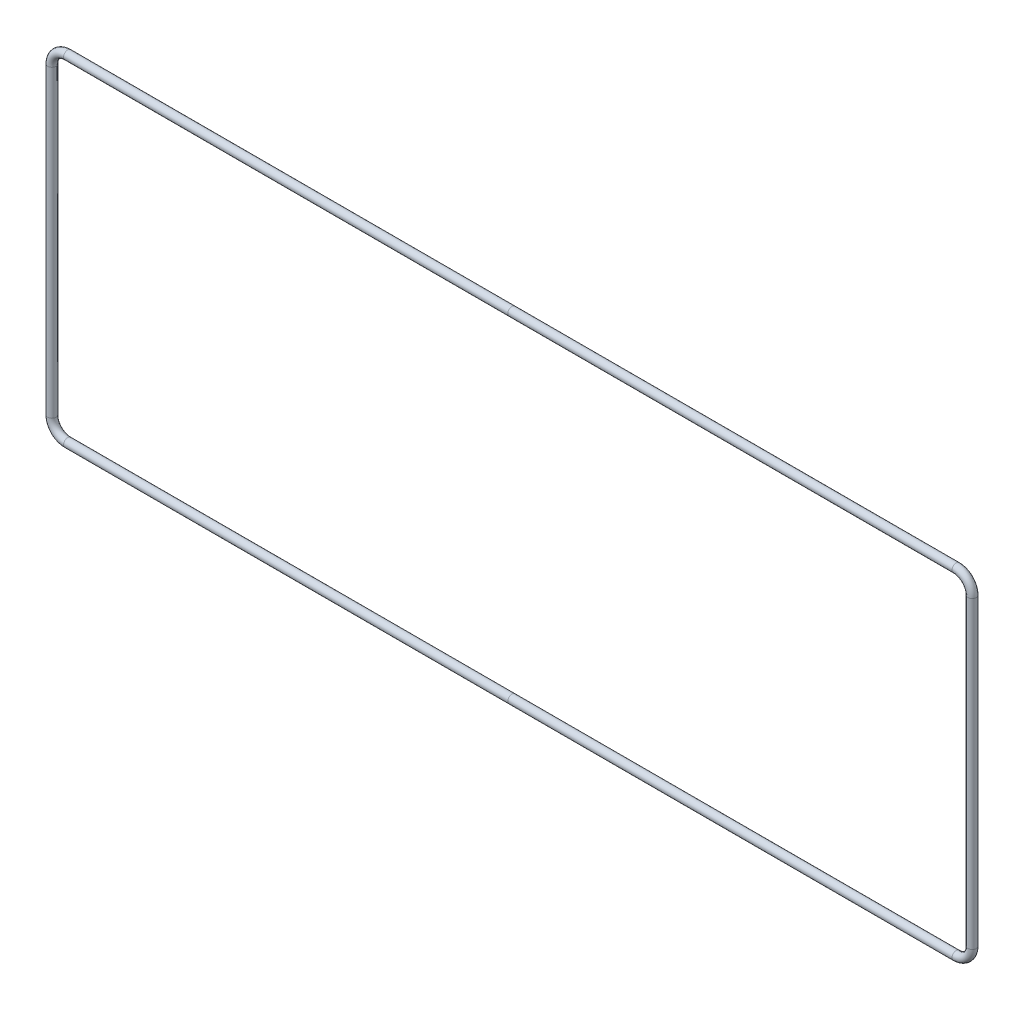
ISO-10303-21;
HEADER;
FILE_DESCRIPTION(('STEP AP214'),'2;1');
FILE_NAME('part.step','',(''),(''),'','','');
FILE_SCHEMA(('AUTOMOTIVE_DESIGN { 1 0 10303 214 1 1 1 1 }'));
ENDSEC;
DATA;
#1=APPLICATION_CONTEXT('core data for automotive mechanical design processes');
#2=APPLICATION_PROTOCOL_DEFINITION('international standard','automotive_design',2000,#1);
#3=PRODUCT_CONTEXT('',#1,'mechanical');
#4=PRODUCT('Part','Part','',(#3));
#5=PRODUCT_RELATED_PRODUCT_CATEGORY('part','',(#4));
#6=PRODUCT_DEFINITION_FORMATION('','',#4);
#7=PRODUCT_DEFINITION_CONTEXT('part definition',#1,'design');
#8=PRODUCT_DEFINITION('design','',#6,#7);
#9=PRODUCT_DEFINITION_SHAPE('','',#8);
#10=(LENGTH_UNIT() NAMED_UNIT(*) SI_UNIT(.MILLI.,.METRE.));
#11=(NAMED_UNIT(*) PLANE_ANGLE_UNIT() SI_UNIT($,.RADIAN.));
#12=(NAMED_UNIT(*) SI_UNIT($,.STERADIAN.) SOLID_ANGLE_UNIT());
#13=UNCERTAINTY_MEASURE_WITH_UNIT(LENGTH_MEASURE(1.E-05),#10,'distance_accuracy_value','');
#14=(GEOMETRIC_REPRESENTATION_CONTEXT(3) GLOBAL_UNCERTAINTY_ASSIGNED_CONTEXT((#13)) GLOBAL_UNIT_ASSIGNED_CONTEXT((#10,
#11,#12)) REPRESENTATION_CONTEXT('',''));
#15=CARTESIAN_POINT('',(0.,0.,0.));
#16=DIRECTION('',(0.,0.,1.));
#17=DIRECTION('',(1.,0.,0.));
#18=AXIS2_PLACEMENT_3D('',#15,#16,#17);
#19=CARTESIAN_POINT('',(-133.,64.9798743683679,0.));
#20=DIRECTION('',(1.,0.,0.));
#21=DIRECTION('',(0.,1.,0.));
#22=AXIS2_PLACEMENT_3D('',#19,#20,#21);
#23=CYLINDRICAL_SURFACE('',#22,1.25);
#24=CARTESIAN_POINT('',(-5.85005856946777E-13,64.9798743683688,0.));
#25=DIRECTION('',(1.,0.,0.));
#26=DIRECTION('',(0.,0.,-1.));
#27=AXIS2_PLACEMENT_3D('',#24,#25,#26);
#28=CIRCLE('',#27,1.25);
#29=CARTESIAN_POINT('',(-5.85005856946777E-13,64.9798743683688,-1.25));
#30=VERTEX_POINT('',#29);
#31=EDGE_CURVE('E66',#30,#30,#28,.T.);
#32=ORIENTED_EDGE('',*,*,#31,.F.);
#33=EDGE_LOOP('',(#32));
#34=FACE_BOUND('',#33,.T.);
#35=CARTESIAN_POINT('',(-133.,64.9798743683679,0.));
#36=DIRECTION('',(1.,0.,0.));
#37=DIRECTION('',(0.,0.,-1.));
#38=AXIS2_PLACEMENT_3D('',#35,#36,#37);
#39=CIRCLE('',#38,1.25);
#40=CARTESIAN_POINT('',(-133.,66.2298743683679,0.));
#41=VERTEX_POINT('',#40);
#42=EDGE_CURVE('E10',#41,#41,#39,.T.);
#43=ORIENTED_EDGE('',*,*,#42,.T.);
#44=EDGE_LOOP('',(#43));
#45=FACE_BOUND('',#44,.T.);
#46=ADVANCED_FACE('F32',(#34,#45),#23,.T.);
#47=CARTESIAN_POINT('',(-133.,60.2298743683679,0.));
#48=DIRECTION('',(0.,0.,-1.));
#49=DIRECTION('',(-1.,0.,0.));
#50=AXIS2_PLACEMENT_3D('',#47,#48,#49);
#51=TOROIDAL_SURFACE('',#50,4.75,1.25);
#52=CARTESIAN_POINT('',(-137.75,60.2298743683679,0.));
#53=DIRECTION('',(0.,1.,0.));
#54=DIRECTION('',(0.,0.,-1.));
#55=AXIS2_PLACEMENT_3D('',#52,#53,#54);
#56=CIRCLE('',#55,1.25);
#57=CARTESIAN_POINT('',(-139.,60.2298743683679,0.));
#58=VERTEX_POINT('',#57);
#59=EDGE_CURVE('E38',#58,#58,#56,.T.);
#60=CARTESIAN_POINT('',(-133.,60.2298743683679,0.));
#61=DIRECTION('',(0.,0.,-1.));
#62=DIRECTION('',(-1.,0.,0.));
#63=AXIS2_PLACEMENT_3D('',#60,#61,#62);
#64=CIRCLE('',#63,6.00000000000001);
#65=EDGE_CURVE('',#58,#41,#64,.T.);
#66=ORIENTED_EDGE('',*,*,#59,.T.);
#67=ORIENTED_EDGE('',*,*,#42,.F.);
#68=ORIENTED_EDGE('',*,*,#65,.T.);
#69=ORIENTED_EDGE('',*,*,#65,.F.);
#70=EDGE_LOOP('',(#66,#68,#67,#69));
#71=FACE_BOUND('',#70,.T.);
#72=ADVANCED_FACE('F73',(#71),#51,.T.);
#73=CARTESIAN_POINT('',(-137.75,-30.7701256316322,0.));
#74=DIRECTION('',(0.,1.,0.));
#75=DIRECTION('',(-1.,0.,0.));
#76=AXIS2_PLACEMENT_3D('',#73,#74,#75);
#77=CYLINDRICAL_SURFACE('',#76,1.25);
#78=ORIENTED_EDGE('',*,*,#59,.F.);
#79=EDGE_LOOP('',(#78));
#80=FACE_BOUND('',#79,.T.);
#81=CARTESIAN_POINT('',(-137.75,-30.7701256316322,0.));
#82=DIRECTION('',(0.,1.,0.));
#83=DIRECTION('',(0.,0.,-1.));
#84=AXIS2_PLACEMENT_3D('',#81,#82,#83);
#85=CIRCLE('',#84,1.25);
#86=CARTESIAN_POINT('',(-139.,-30.7701256316322,0.));
#87=VERTEX_POINT('',#86);
#88=EDGE_CURVE('E42',#87,#87,#85,.T.);
#89=ORIENTED_EDGE('',*,*,#88,.T.);
#90=EDGE_LOOP('',(#89));
#91=FACE_BOUND('',#90,.T.);
#92=ADVANCED_FACE('F77',(#80,#91),#77,.T.);
#93=CARTESIAN_POINT('',(-133.,-30.7701256316322,0.));
#94=DIRECTION('',(0.,0.,-1.));
#95=DIRECTION('',(-1.,0.,0.));
#96=AXIS2_PLACEMENT_3D('',#93,#94,#95);
#97=TOROIDAL_SURFACE('',#96,4.75,1.25);
#98=CARTESIAN_POINT('',(-133.,-35.5201256316322,0.));
#99=DIRECTION('',(-1.,0.,0.));
#100=DIRECTION('',(0.,0.,-1.));
#101=AXIS2_PLACEMENT_3D('',#98,#99,#100);
#102=CIRCLE('',#101,1.25);
#103=CARTESIAN_POINT('',(-133.,-36.7701256316322,0.));
#104=VERTEX_POINT('',#103);
#105=EDGE_CURVE('E46',#104,#104,#102,.T.);
#106=CARTESIAN_POINT('',(-133.,-30.7701256316322,0.));
#107=DIRECTION('',(0.,0.,-1.));
#108=DIRECTION('',(-1.,0.,0.));
#109=AXIS2_PLACEMENT_3D('',#106,#107,#108);
#110=CIRCLE('',#109,6.00000000000001);
#111=EDGE_CURVE('',#104,#87,#110,.T.);
#112=ORIENTED_EDGE('',*,*,#105,.T.);
#113=ORIENTED_EDGE('',*,*,#88,.F.);
#114=ORIENTED_EDGE('',*,*,#111,.T.);
#115=ORIENTED_EDGE('',*,*,#111,.F.);
#116=EDGE_LOOP('',(#112,#114,#113,#115));
#117=FACE_BOUND('',#116,.T.);
#118=ADVANCED_FACE('F82',(#117),#97,.T.);
#119=CARTESIAN_POINT('',(2.22044604925031E-13,-35.5201256316313,0.));
#120=DIRECTION('',(-1.,0.,0.));
#121=DIRECTION('',(0.,-1.,0.));
#122=AXIS2_PLACEMENT_3D('',#119,#120,#121);
#123=CYLINDRICAL_SURFACE('',#122,1.25);
#124=ORIENTED_EDGE('',*,*,#105,.F.);
#125=EDGE_LOOP('',(#124));
#126=FACE_BOUND('',#125,.T.);
#127=CARTESIAN_POINT('',(2.22044604925031E-13,-35.5201256316313,0.));
#128=DIRECTION('',(-1.,0.,0.));
#129=DIRECTION('',(0.,0.,-1.));
#130=AXIS2_PLACEMENT_3D('',#127,#128,#129);
#131=CIRCLE('',#130,1.25);
#132=CARTESIAN_POINT('',(2.22044604925031E-13,-35.5201256316313,-1.25));
#133=VERTEX_POINT('',#132);
#134=EDGE_CURVE('E51',#133,#133,#131,.T.);
#135=ORIENTED_EDGE('',*,*,#134,.T.);
#136=EDGE_LOOP('',(#135));
#137=FACE_BOUND('',#136,.T.);
#138=ADVANCED_FACE('F88',(#126,#137),#123,.T.);
#139=CARTESIAN_POINT('',(133.,-35.5201256316313,0.));
#140=DIRECTION('',(-1.,0.,0.));
#141=DIRECTION('',(0.,0.,1.));
#142=AXIS2_PLACEMENT_3D('',#139,#140,#141);
#143=CYLINDRICAL_SURFACE('',#142,1.25);
#144=ORIENTED_EDGE('',*,*,#134,.F.);
#145=EDGE_LOOP('',(#144));
#146=FACE_BOUND('',#145,.T.);
#147=CARTESIAN_POINT('',(133.,-35.5201256316313,0.));
#148=DIRECTION('',(-1.,0.,0.));
#149=DIRECTION('',(0.,0.,-1.));
#150=AXIS2_PLACEMENT_3D('',#147,#148,#149);
#151=CIRCLE('',#150,1.25);
#152=CARTESIAN_POINT('',(133.,-36.7701256316313,0.));
#153=VERTEX_POINT('',#152);
#154=EDGE_CURVE('E54',#153,#153,#151,.T.);
#155=ORIENTED_EDGE('',*,*,#154,.T.);
#156=EDGE_LOOP('',(#155));
#157=FACE_BOUND('',#156,.T.);
#158=ADVANCED_FACE('F92',(#146,#157),#143,.T.);
#159=CARTESIAN_POINT('',(133.,-30.7701256316313,0.));
#160=DIRECTION('',(0.,0.,-1.));
#161=DIRECTION('',(-1.,0.,0.));
#162=AXIS2_PLACEMENT_3D('',#159,#160,#161);
#163=TOROIDAL_SURFACE('',#162,4.75,1.25);
#164=CARTESIAN_POINT('',(137.75,-30.7701256316313,0.));
#165=DIRECTION('',(0.,-1.,0.));
#166=DIRECTION('',(0.,0.,-1.));
#167=AXIS2_PLACEMENT_3D('',#164,#165,#166);
#168=CIRCLE('',#167,1.25);
#169=CARTESIAN_POINT('',(139.,-30.7701256316313,0.));
#170=VERTEX_POINT('',#169);
#171=EDGE_CURVE('E57',#170,#170,#168,.T.);
#172=CARTESIAN_POINT('',(133.,-30.7701256316313,0.));
#173=DIRECTION('',(0.,0.,-1.));
#174=DIRECTION('',(-1.,0.,0.));
#175=AXIS2_PLACEMENT_3D('',#172,#173,#174);
#176=CIRCLE('',#175,6.00000000000001);
#177=EDGE_CURVE('',#170,#153,#176,.T.);
#178=ORIENTED_EDGE('',*,*,#171,.T.);
#179=ORIENTED_EDGE('',*,*,#154,.F.);
#180=ORIENTED_EDGE('',*,*,#177,.T.);
#181=ORIENTED_EDGE('',*,*,#177,.F.);
#182=EDGE_LOOP('',(#178,#180,#179,#181));
#183=FACE_BOUND('',#182,.T.);
#184=ADVANCED_FACE('F96',(#183),#163,.T.);
#185=CARTESIAN_POINT('',(137.75,60.2298743683688,0.));
#186=DIRECTION('',(0.,-1.,0.));
#187=DIRECTION('',(0.,0.,-1.));
#188=AXIS2_PLACEMENT_3D('',#185,#186,#187);
#189=CYLINDRICAL_SURFACE('',#188,1.25);
#190=ORIENTED_EDGE('',*,*,#171,.F.);
#191=EDGE_LOOP('',(#190));
#192=FACE_BOUND('',#191,.T.);
#193=CARTESIAN_POINT('',(137.75,60.2298743683688,0.));
#194=DIRECTION('',(0.,-1.,0.));
#195=DIRECTION('',(0.,0.,-1.));
#196=AXIS2_PLACEMENT_3D('',#193,#194,#195);
#197=CIRCLE('',#196,1.25);
#198=CARTESIAN_POINT('',(139.,60.2298743683688,0.));
#199=VERTEX_POINT('',#198);
#200=EDGE_CURVE('E60',#199,#199,#197,.T.);
#201=ORIENTED_EDGE('',*,*,#200,.T.);
#202=EDGE_LOOP('',(#201));
#203=FACE_BOUND('',#202,.T.);
#204=ADVANCED_FACE('F100',(#192,#203),#189,.T.);
#205=CARTESIAN_POINT('',(133.,60.2298743683688,0.));
#206=DIRECTION('',(0.,0.,-1.));
#207=DIRECTION('',(-1.,0.,0.));
#208=AXIS2_PLACEMENT_3D('',#205,#206,#207);
#209=TOROIDAL_SURFACE('',#208,4.74999999999999,1.25);
#210=CARTESIAN_POINT('',(133.,64.9798743683688,0.));
#211=DIRECTION('',(1.,0.,0.));
#212=DIRECTION('',(0.,0.,-1.));
#213=AXIS2_PLACEMENT_3D('',#210,#211,#212);
#214=CIRCLE('',#213,1.25);
#215=CARTESIAN_POINT('',(133.,66.2298743683687,0.));
#216=VERTEX_POINT('',#215);
#217=EDGE_CURVE('E63',#216,#216,#214,.T.);
#218=CARTESIAN_POINT('',(133.,60.2298743683688,0.));
#219=DIRECTION('',(0.,0.,-1.));
#220=DIRECTION('',(-1.,0.,0.));
#221=AXIS2_PLACEMENT_3D('',#218,#219,#220);
#222=CIRCLE('',#221,5.99999999999999);
#223=EDGE_CURVE('',#216,#199,#222,.T.);
#224=ORIENTED_EDGE('',*,*,#217,.T.);
#225=ORIENTED_EDGE('',*,*,#200,.F.);
#226=ORIENTED_EDGE('',*,*,#223,.T.);
#227=ORIENTED_EDGE('',*,*,#223,.F.);
#228=EDGE_LOOP('',(#224,#226,#225,#227));
#229=FACE_BOUND('',#228,.T.);
#230=ADVANCED_FACE('F104',(#229),#209,.T.);
#231=CARTESIAN_POINT('',(-5.85005856946777E-13,64.9798743683688,0.));
#232=DIRECTION('',(1.,0.,0.));
#233=DIRECTION('',(0.,0.,-1.));
#234=AXIS2_PLACEMENT_3D('',#231,#232,#233);
#235=CYLINDRICAL_SURFACE('',#234,1.25);
#236=ORIENTED_EDGE('',*,*,#217,.F.);
#237=EDGE_LOOP('',(#236));
#238=FACE_BOUND('',#237,.T.);
#239=ORIENTED_EDGE('',*,*,#31,.T.);
#240=EDGE_LOOP('',(#239));
#241=FACE_BOUND('',#240,.T.);
#242=ADVANCED_FACE('F70',(#238,#241),#235,.T.);
#243=CLOSED_SHELL('',(#46,#72,#92,#118,#138,#158,#184,#204,#230,#242));
#244=MANIFOLD_SOLID_BREP('B2',#243);
#245=ADVANCED_BREP_SHAPE_REPRESENTATION('',(#18,#244),#14);
#246=SHAPE_DEFINITION_REPRESENTATION(#9,#245);
ENDSEC;
END-ISO-10303-21;
